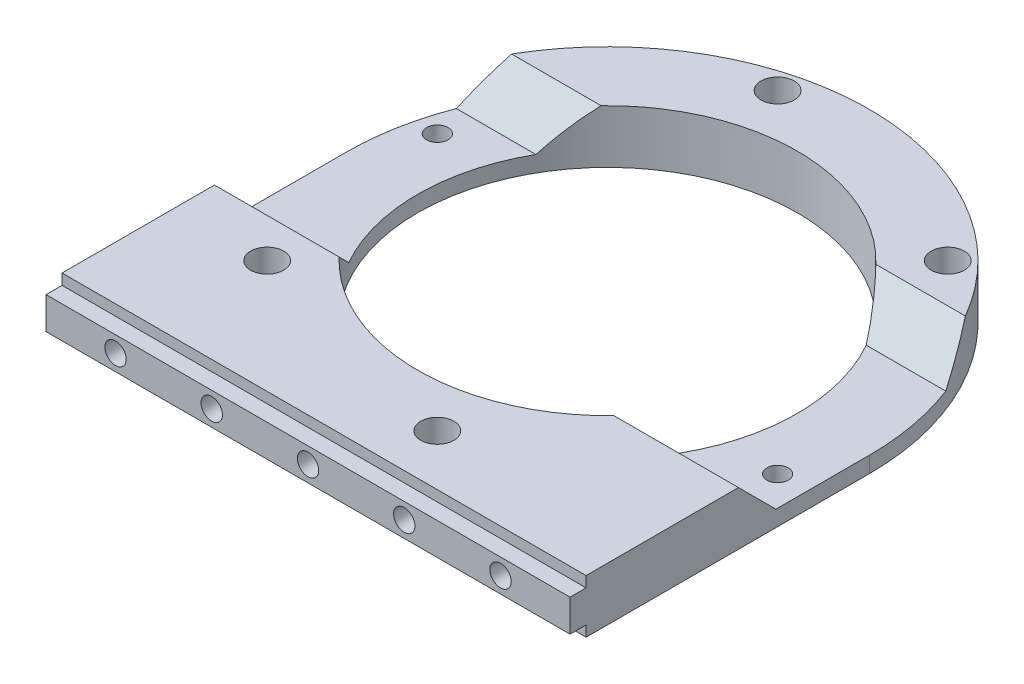
ISO-10303-21;
HEADER;
FILE_DESCRIPTION(('STEP AP214'),'2;1');
FILE_NAME('part.step','',(''),(''),'','','');
FILE_SCHEMA(('AUTOMOTIVE_DESIGN { 1 0 10303 214 1 1 1 1 }'));
ENDSEC;
DATA;
#1=APPLICATION_CONTEXT('core data for automotive mechanical design processes');
#2=APPLICATION_PROTOCOL_DEFINITION('international standard','automotive_design',2000,#1);
#3=PRODUCT_CONTEXT('',#1,'mechanical');
#4=PRODUCT('Part','Part','',(#3));
#5=PRODUCT_RELATED_PRODUCT_CATEGORY('part','',(#4));
#6=PRODUCT_DEFINITION_FORMATION('','',#4);
#7=PRODUCT_DEFINITION_CONTEXT('part definition',#1,'design');
#8=PRODUCT_DEFINITION('design','',#6,#7);
#9=PRODUCT_DEFINITION_SHAPE('','',#8);
#10=(LENGTH_UNIT() NAMED_UNIT(*) SI_UNIT(.MILLI.,.METRE.));
#11=(NAMED_UNIT(*) PLANE_ANGLE_UNIT() SI_UNIT($,.RADIAN.));
#12=(NAMED_UNIT(*) SI_UNIT($,.STERADIAN.) SOLID_ANGLE_UNIT());
#13=UNCERTAINTY_MEASURE_WITH_UNIT(LENGTH_MEASURE(1.E-05),#10,'distance_accuracy_value','');
#14=(GEOMETRIC_REPRESENTATION_CONTEXT(3) GLOBAL_UNCERTAINTY_ASSIGNED_CONTEXT((#13)) GLOBAL_UNIT_ASSIGNED_CONTEXT((#10,
#11,#12)) REPRESENTATION_CONTEXT('',''));
#15=CARTESIAN_POINT('',(0.,0.,0.));
#16=DIRECTION('',(0.,0.,1.));
#17=DIRECTION('',(1.,0.,0.));
#18=AXIS2_PLACEMENT_3D('',#15,#16,#17);
#19=CARTESIAN_POINT('',(11.6468570296169,10.,43.4666621830049));
#20=DIRECTION('',(0.,-1.,0.));
#21=DIRECTION('',(0.,0.,-1.));
#22=AXIS2_PLACEMENT_3D('',#19,#20,#21);
#23=CYLINDRICAL_SURFACE('',#22,2.00000000000043);
#24=CARTESIAN_POINT('',(11.6468570296169,0.,43.4666621830049));
#25=DIRECTION('',(0.,1.,0.));
#26=DIRECTION('',(0.,0.,1.));
#27=AXIS2_PLACEMENT_3D('',#24,#25,#26);
#28=CIRCLE('',#27,2.00000000000043);
#29=CARTESIAN_POINT('',(11.6468570296169,0.,45.4666621830053));
#30=VERTEX_POINT('',#29);
#31=EDGE_CURVE('E250',#30,#30,#28,.T.);
#32=ORIENTED_EDGE('',*,*,#31,.F.);
#33=EDGE_LOOP('',(#32));
#34=FACE_BOUND('',#33,.T.);
#35=CARTESIAN_POINT('',(11.6468570296169,5.,43.4666621830049));
#36=DIRECTION('',(0.,1.,0.));
#37=DIRECTION('',(0.,0.,1.));
#38=AXIS2_PLACEMENT_3D('',#35,#36,#37);
#39=CIRCLE('',#38,2.00000000000043);
#40=CARTESIAN_POINT('',(11.6468570296169,5.,45.4666621830053));
#41=VERTEX_POINT('',#40);
#42=EDGE_CURVE('E48',#41,#41,#39,.T.);
#43=ORIENTED_EDGE('',*,*,#42,.T.);
#44=EDGE_LOOP('',(#43));
#45=FACE_BOUND('',#44,.T.);
#46=ADVANCED_FACE('F43',(#34,#45),#23,.F.);
#47=CARTESIAN_POINT('',(31.8198051533933,10.,-31.8198051533991));
#48=DIRECTION('',(0.,-1.,0.));
#49=DIRECTION('',(0.,0.,-1.));
#50=AXIS2_PLACEMENT_3D('',#47,#48,#49);
#51=CYLINDRICAL_SURFACE('',#50,2.00000000000403);
#52=CARTESIAN_POINT('',(31.8198051533933,0.,-31.8198051533991));
#53=DIRECTION('',(0.,1.,0.));
#54=DIRECTION('',(0.,0.,1.));
#55=AXIS2_PLACEMENT_3D('',#52,#53,#54);
#56=CIRCLE('',#55,2.00000000000403);
#57=CARTESIAN_POINT('',(31.8198051533933,0.,-29.8198051533951));
#58=VERTEX_POINT('',#57);
#59=EDGE_CURVE('E244',#58,#58,#56,.T.);
#60=ORIENTED_EDGE('',*,*,#59,.F.);
#61=EDGE_LOOP('',(#60));
#62=FACE_BOUND('',#61,.T.);
#63=CARTESIAN_POINT('',(31.8198051533933,5.,-31.8198051533991));
#64=DIRECTION('',(0.,1.,0.));
#65=DIRECTION('',(0.,0.,1.));
#66=AXIS2_PLACEMENT_3D('',#63,#64,#65);
#67=CIRCLE('',#66,2.00000000000403);
#68=CARTESIAN_POINT('',(31.8198051533933,5.,-29.8198051533951));
#69=VERTEX_POINT('',#68);
#70=EDGE_CURVE('E304',#69,#69,#67,.T.);
#71=ORIENTED_EDGE('',*,*,#70,.T.);
#72=EDGE_LOOP('',(#71));
#73=FACE_BOUND('',#72,.T.);
#74=ADVANCED_FACE('F459',(#62,#73),#51,.F.);
#75=CARTESIAN_POINT('',(-11.6468570296155,10.,-43.4666621830098));
#76=DIRECTION('',(0.,-1.,0.));
#77=DIRECTION('',(0.,0.,-1.));
#78=AXIS2_PLACEMENT_3D('',#75,#76,#77);
#79=CYLINDRICAL_SURFACE('',#78,2.00000000000261);
#80=CARTESIAN_POINT('',(-11.6468570296155,0.,-43.4666621830098));
#81=DIRECTION('',(0.,1.,0.));
#82=DIRECTION('',(0.,0.,1.));
#83=AXIS2_PLACEMENT_3D('',#80,#81,#82);
#84=CIRCLE('',#83,2.00000000000261);
#85=CARTESIAN_POINT('',(-11.6468570296155,0.,-41.4666621830072));
#86=VERTEX_POINT('',#85);
#87=EDGE_CURVE('E241',#86,#86,#84,.T.);
#88=ORIENTED_EDGE('',*,*,#87,.F.);
#89=EDGE_LOOP('',(#88));
#90=FACE_BOUND('',#89,.T.);
#91=CARTESIAN_POINT('',(-11.6468570296155,5.,-43.4666621830098));
#92=DIRECTION('',(0.,1.,0.));
#93=DIRECTION('',(0.,0.,1.));
#94=AXIS2_PLACEMENT_3D('',#91,#92,#93);
#95=CIRCLE('',#94,2.00000000000261);
#96=CARTESIAN_POINT('',(-11.6468570296155,5.,-41.4666621830072));
#97=VERTEX_POINT('',#96);
#98=EDGE_CURVE('E301',#97,#97,#95,.T.);
#99=ORIENTED_EDGE('',*,*,#98,.T.);
#100=EDGE_LOOP('',(#99));
#101=FACE_BOUND('',#100,.T.);
#102=ADVANCED_FACE('F465',(#90,#101),#79,.F.);
#103=CARTESIAN_POINT('',(-31.8198051533919,10.,31.8198051533942));
#104=DIRECTION('',(0.,-1.,0.));
#105=DIRECTION('',(0.,0.,-1.));
#106=AXIS2_PLACEMENT_3D('',#103,#104,#105);
#107=CYLINDRICAL_SURFACE('',#106,1.99999999999913);
#108=CARTESIAN_POINT('',(-31.8198051533919,0.,31.8198051533942));
#109=DIRECTION('',(0.,1.,0.));
#110=DIRECTION('',(0.,0.,1.));
#111=AXIS2_PLACEMENT_3D('',#108,#109,#110);
#112=CIRCLE('',#111,1.99999999999913);
#113=CARTESIAN_POINT('',(-31.8198051533919,0.,33.8198051533934));
#114=VERTEX_POINT('',#113);
#115=EDGE_CURVE('E221',#114,#114,#112,.T.);
#116=ORIENTED_EDGE('',*,*,#115,.F.);
#117=EDGE_LOOP('',(#116));
#118=FACE_BOUND('',#117,.T.);
#119=CARTESIAN_POINT('',(-31.8198051533919,5.,31.8198051533942));
#120=DIRECTION('',(0.,1.,0.));
#121=DIRECTION('',(0.,0.,1.));
#122=AXIS2_PLACEMENT_3D('',#119,#120,#121);
#123=CIRCLE('',#122,1.99999999999913);
#124=CARTESIAN_POINT('',(-31.8198051533919,5.,33.8198051533934));
#125=VERTEX_POINT('',#124);
#126=EDGE_CURVE('E298',#125,#125,#123,.T.);
#127=ORIENTED_EDGE('',*,*,#126,.T.);
#128=EDGE_LOOP('',(#127));
#129=FACE_BOUND('',#128,.T.);
#130=ADVANCED_FACE('F478',(#118,#129),#107,.F.);
#131=CARTESIAN_POINT('',(0.,10.,0.));
#132=DIRECTION('',(0.,1.,0.));
#133=DIRECTION('',(0.,0.,1.));
#134=AXIS2_PLACEMENT_3D('',#131,#132,#133);
#135=PLANE('',#134);
#136=CARTESIAN_POINT('',(11.6468570296155,10.,43.4666621830099));
#137=DIRECTION('',(0.,1.,0.));
#138=DIRECTION('',(0.,0.,1.));
#139=AXIS2_PLACEMENT_3D('',#136,#137,#138);
#140=CIRCLE('',#139,3.10000000000027);
#141=CARTESIAN_POINT('',(11.6468570296155,10.,46.5666621830102));
#142=VERTEX_POINT('',#141);
#143=EDGE_CURVE('E329',#142,#142,#140,.T.);
#144=ORIENTED_EDGE('',*,*,#143,.F.);
#145=EDGE_LOOP('',(#144));
#146=FACE_BOUND('',#145,.T.);
#147=CARTESIAN_POINT('',(-31.8198051533951,10.,31.8198051533974));
#148=DIRECTION('',(0.,1.,0.));
#149=DIRECTION('',(0.,0.,1.));
#150=AXIS2_PLACEMENT_3D('',#147,#148,#149);
#151=CIRCLE('',#150,3.10000000000043);
#152=CARTESIAN_POINT('',(-31.8198051533951,10.,34.9198051533978));
#153=VERTEX_POINT('',#152);
#154=EDGE_CURVE('E322',#153,#153,#151,.T.);
#155=ORIENTED_EDGE('',*,*,#154,.F.);
#156=EDGE_LOOP('',(#155));
#157=FACE_BOUND('',#156,.T.);
#158=DIRECTION('',(0.,0.,-1.));
#159=VECTOR('',#158,1.);
#160=CARTESIAN_POINT('',(49.,10.,0.));
#161=LINE('',#160,#159);
#162=CARTESIAN_POINT('',(49.,10.,53.));
#163=VERTEX_POINT('',#162);
#164=CARTESIAN_POINT('',(49.,10.,24.5));
#165=VERTEX_POINT('',#164);
#166=EDGE_CURVE('E222',#163,#165,#161,.T.);
#167=ORIENTED_EDGE('',*,*,#166,.T.);
#168=DIRECTION('',(-1.,0.,0.));
#169=VECTOR('',#168,1.);
#170=CARTESIAN_POINT('',(30.886890422961,10.,24.5));
#171=LINE('',#170,#169);
#172=CARTESIAN_POINT('',(25.6904651573302,10.,24.5));
#173=VERTEX_POINT('',#172);
#174=EDGE_CURVE('E284',#165,#173,#171,.T.);
#175=ORIENTED_EDGE('',*,*,#174,.T.);
#176=CARTESIAN_POINT('',(0.,10.,0.));
#177=DIRECTION('',(0.,1.,0.));
#178=DIRECTION('',(0.,0.,1.));
#179=AXIS2_PLACEMENT_3D('',#176,#177,#178);
#180=CIRCLE('',#179,35.5);
#181=CARTESIAN_POINT('',(-25.6904651573302,10.,24.5));
#182=VERTEX_POINT('',#181);
#183=EDGE_CURVE('E231',#182,#173,#180,.T.);
#184=ORIENTED_EDGE('',*,*,#183,.F.);
#185=DIRECTION('',(-1.,0.,0.));
#186=VECTOR('',#185,1.);
#187=CARTESIAN_POINT('',(-49.,10.,24.5));
#188=LINE('',#187,#186);
#189=CARTESIAN_POINT('',(-49.,10.,24.5));
#190=VERTEX_POINT('',#189);
#191=EDGE_CURVE('E282',#182,#190,#188,.T.);
#192=ORIENTED_EDGE('',*,*,#191,.T.);
#193=DIRECTION('',(0.,0.,1.));
#194=VECTOR('',#193,1.);
#195=CARTESIAN_POINT('',(-49.,10.,0.));
#196=LINE('',#195,#194);
#197=CARTESIAN_POINT('',(-49.,10.,53.));
#198=VERTEX_POINT('',#197);
#199=EDGE_CURVE('E165',#190,#198,#196,.T.);
#200=ORIENTED_EDGE('',*,*,#199,.T.);
#201=DIRECTION('',(1.,0.,0.));
#202=VECTOR('',#201,1.);
#203=CARTESIAN_POINT('',(0.,10.,53.));
#204=LINE('',#203,#202);
#205=EDGE_CURVE('E229',#198,#163,#204,.T.);
#206=ORIENTED_EDGE('',*,*,#205,.T.);
#207=EDGE_LOOP('',(#167,#175,#184,#192,#200,#206));
#208=FACE_BOUND('',#207,.T.);
#209=ADVANCED_FACE('F425',(#146,#157,#208),#135,.T.);
#210=CARTESIAN_POINT('',(0.,10.,53.));
#211=DIRECTION('',(0.,0.,-1.));
#212=DIRECTION('',(-1.,0.,0.));
#213=AXIS2_PLACEMENT_3D('',#210,#211,#212);
#214=PLANE('',#213);
#215=DIRECTION('',(1.,0.,0.));
#216=VECTOR('',#215,1.);
#217=CARTESIAN_POINT('',(-49.,2.,53.));
#218=LINE('',#217,#216);
#219=CARTESIAN_POINT('',(-49.,2.,53.));
#220=VERTEX_POINT('',#219);
#221=CARTESIAN_POINT('',(49.,2.,53.));
#222=VERTEX_POINT('',#221);
#223=EDGE_CURVE('E198',#220,#222,#218,.T.);
#224=ORIENTED_EDGE('',*,*,#223,.F.);
#225=DIRECTION('',(0.,-1.,0.));
#226=VECTOR('',#225,1.);
#227=CARTESIAN_POINT('',(-49.,10.,53.));
#228=LINE('',#227,#226);
#229=CARTESIAN_POINT('',(-49.,0.,53.));
#230=VERTEX_POINT('',#229);
#231=EDGE_CURVE('E270',#220,#230,#228,.T.);
#232=ORIENTED_EDGE('',*,*,#231,.T.);
#233=DIRECTION('',(1.,0.,0.));
#234=VECTOR('',#233,1.);
#235=CARTESIAN_POINT('',(0.,0.,53.));
#236=LINE('',#235,#234);
#237=CARTESIAN_POINT('',(49.,0.,53.));
#238=VERTEX_POINT('',#237);
#239=EDGE_CURVE('E262',#230,#238,#236,.T.);
#240=ORIENTED_EDGE('',*,*,#239,.T.);
#241=DIRECTION('',(0.,-1.,0.));
#242=VECTOR('',#241,1.);
#243=CARTESIAN_POINT('',(49.,10.,53.));
#244=LINE('',#243,#242);
#245=EDGE_CURVE('E235',#222,#238,#244,.T.);
#246=ORIENTED_EDGE('',*,*,#245,.F.);
#247=EDGE_LOOP('',(#224,#232,#240,#246));
#248=FACE_BOUND('',#247,.T.);
#249=ADVANCED_FACE('F414',(#248),#214,.F.);
#250=DIRECTION('',(-1.,0.,0.));
#251=VECTOR('',#250,1.);
#252=CARTESIAN_POINT('',(-49.,8.,53.));
#253=LINE('',#252,#251);
#254=CARTESIAN_POINT('',(49.,8.,53.));
#255=VERTEX_POINT('',#254);
#256=CARTESIAN_POINT('',(-49.,8.,53.));
#257=VERTEX_POINT('',#256);
#258=EDGE_CURVE('E205',#255,#257,#253,.T.);
#259=ORIENTED_EDGE('',*,*,#258,.F.);
#260=EDGE_CURVE('E267',#163,#255,#244,.T.);
#261=ORIENTED_EDGE('',*,*,#260,.F.);
#262=ORIENTED_EDGE('',*,*,#205,.F.);
#263=EDGE_CURVE('E271',#198,#257,#228,.T.);
#264=ORIENTED_EDGE('',*,*,#263,.T.);
#265=EDGE_LOOP('',(#259,#261,#262,#264));
#266=FACE_BOUND('',#265,.T.);
#267=ADVANCED_FACE('F448',(#266),#214,.F.);
#268=CARTESIAN_POINT('',(49.,10.,0.));
#269=DIRECTION('',(-1.,0.,0.));
#270=DIRECTION('',(0.,0.,1.));
#271=AXIS2_PLACEMENT_3D('',#268,#269,#270);
#272=PLANE('',#271);
#273=DIRECTION('',(0.,0.,-1.));
#274=VECTOR('',#273,1.);
#275=CARTESIAN_POINT('',(49.,3.,17.5));
#276=LINE('',#275,#274);
#277=CARTESIAN_POINT('',(49.,3.,17.5));
#278=VERTEX_POINT('',#277);
#279=CARTESIAN_POINT('',(49.,3.,0.));
#280=VERTEX_POINT('',#279);
#281=EDGE_CURVE('E309',#278,#280,#276,.T.);
#282=ORIENTED_EDGE('',*,*,#281,.F.);
#283=DIRECTION('',(0.,0.707106781186546,0.707106781186549));
#284=VECTOR('',#283,1.);
#285=CARTESIAN_POINT('',(49.,3.00000000000001,17.5));
#286=LINE('',#285,#284);
#287=EDGE_CURVE('E280',#278,#165,#286,.T.);
#288=ORIENTED_EDGE('',*,*,#287,.T.);
#289=ORIENTED_EDGE('',*,*,#166,.F.);
#290=ORIENTED_EDGE('',*,*,#260,.T.);
#291=DIRECTION('',(0.,0.,-1.));
#292=VECTOR('',#291,1.);
#293=CARTESIAN_POINT('',(49.,8.,56.));
#294=LINE('',#293,#292);
#295=CARTESIAN_POINT('',(49.,8.,56.));
#296=VERTEX_POINT('',#295);
#297=EDGE_CURVE('E218',#296,#255,#294,.T.);
#298=ORIENTED_EDGE('',*,*,#297,.F.);
#299=DIRECTION('',(0.,1.,0.));
#300=VECTOR('',#299,1.);
#301=CARTESIAN_POINT('',(49.,2.,56.));
#302=LINE('',#301,#300);
#303=CARTESIAN_POINT('',(49.,2.,56.));
#304=VERTEX_POINT('',#303);
#305=EDGE_CURVE('E194',#304,#296,#302,.T.);
#306=ORIENTED_EDGE('',*,*,#305,.F.);
#307=DIRECTION('',(0.,0.,-1.));
#308=VECTOR('',#307,1.);
#309=CARTESIAN_POINT('',(49.,2.,56.));
#310=LINE('',#309,#308);
#311=EDGE_CURVE('E204',#304,#222,#310,.T.);
#312=ORIENTED_EDGE('',*,*,#311,.T.);
#313=ORIENTED_EDGE('',*,*,#245,.T.);
#314=DIRECTION('',(0.,0.,-1.));
#315=VECTOR('',#314,1.);
#316=CARTESIAN_POINT('',(49.,0.,0.));
#317=LINE('',#316,#315);
#318=CARTESIAN_POINT('',(49.,0.,0.));
#319=VERTEX_POINT('',#318);
#320=EDGE_CURVE('E253',#238,#319,#317,.T.);
#321=ORIENTED_EDGE('',*,*,#320,.T.);
#322=DIRECTION('',(0.,-1.,0.));
#323=VECTOR('',#322,1.);
#324=CARTESIAN_POINT('',(49.,10.,0.));
#325=LINE('',#324,#323);
#326=EDGE_CURVE('E275',#280,#319,#325,.T.);
#327=ORIENTED_EDGE('',*,*,#326,.F.);
#328=EDGE_LOOP('',(#282,#288,#289,#290,#298,#306,#312,#313,#321,#327));
#329=FACE_BOUND('',#328,.T.);
#330=ADVANCED_FACE('F401',(#329),#272,.F.);
#331=CARTESIAN_POINT('',(0.,10.,0.));
#332=DIRECTION('',(0.,-1.,0.));
#333=DIRECTION('',(0.,0.,-1.));
#334=AXIS2_PLACEMENT_3D('',#331,#332,#333);
#335=CYLINDRICAL_SURFACE('',#334,49.);
#336=CARTESIAN_POINT('',(0.,10.,0.));
#337=DIRECTION('',(0.,1.,0.));
#338=DIRECTION('',(0.,0.,1.));
#339=AXIS2_PLACEMENT_3D('',#336,#337,#338);
#340=CIRCLE('',#339,49.);
#341=CARTESIAN_POINT('',(42.4352447854375,10.,-24.5));
#342=VERTEX_POINT('',#341);
#343=CARTESIAN_POINT('',(-42.4352447854375,10.,-24.5));
#344=VERTEX_POINT('',#343);
#345=EDGE_CURVE('E225',#342,#344,#340,.T.);
#346=ORIENTED_EDGE('',*,*,#345,.F.);
#347=CARTESIAN_POINT('',(0.,-14.4999999999999,0.));
#348=DIRECTION('',(0.,0.707106781186549,0.707106781186546));
#349=DIRECTION('',(0.,-0.707106781186546,0.707106781186549));
#350=AXIS2_PLACEMENT_3D('',#347,#348,#349);
#351=ELLIPSE('',#350,69.2964645562815,49.);
#352=CARTESIAN_POINT('',(45.7684389071771,3.,-17.5));
#353=VERTEX_POINT('',#352);
#354=EDGE_CURVE('E53',#342,#353,#351,.F.);
#355=ORIENTED_EDGE('',*,*,#354,.T.);
#356=CARTESIAN_POINT('',(0.,3.,0.));
#357=DIRECTION('',(0.,-1.,0.));
#358=DIRECTION('',(0.,0.,-1.));
#359=AXIS2_PLACEMENT_3D('',#356,#357,#358);
#360=CIRCLE('',#359,49.);
#361=EDGE_CURVE('E193',#353,#280,#360,.T.);
#362=ORIENTED_EDGE('',*,*,#361,.T.);
#363=ORIENTED_EDGE('',*,*,#326,.T.);
#364=CARTESIAN_POINT('',(0.,0.,0.));
#365=DIRECTION('',(0.,1.,0.));
#366=DIRECTION('',(0.,0.,1.));
#367=AXIS2_PLACEMENT_3D('',#364,#365,#366);
#368=CIRCLE('',#367,49.);
#369=CARTESIAN_POINT('',(-49.,0.,0.));
#370=VERTEX_POINT('',#369);
#371=EDGE_CURVE('E256',#319,#370,#368,.T.);
#372=ORIENTED_EDGE('',*,*,#371,.T.);
#373=DIRECTION('',(0.,-1.,0.));
#374=VECTOR('',#373,1.);
#375=CARTESIAN_POINT('',(-49.,10.,0.));
#376=LINE('',#375,#374);
#377=CARTESIAN_POINT('',(-49.,3.,0.));
#378=VERTEX_POINT('',#377);
#379=EDGE_CURVE('E273',#378,#370,#376,.T.);
#380=ORIENTED_EDGE('',*,*,#379,.F.);
#381=CARTESIAN_POINT('',(-45.7684389071771,3.,-17.5));
#382=VERTEX_POINT('',#381);
#383=EDGE_CURVE('E176',#378,#382,#360,.T.);
#384=ORIENTED_EDGE('',*,*,#383,.T.);
#385=CARTESIAN_POINT('',(0.,-14.4999999999999,0.));
#386=DIRECTION('',(0.,0.707106781186549,0.707106781186546));
#387=DIRECTION('',(0.,-0.707106781186546,0.707106781186549));
#388=AXIS2_PLACEMENT_3D('',#385,#386,#387);
#389=ELLIPSE('',#388,69.2964645562815,49.);
#390=EDGE_CURVE('E61',#382,#344,#389,.F.);
#391=ORIENTED_EDGE('',*,*,#390,.T.);
#392=EDGE_LOOP('',(#346,#355,#362,#363,#372,#380,#384,#391));
#393=FACE_BOUND('',#392,.T.);
#394=ADVANCED_FACE('F420',(#393),#335,.T.);
#395=CARTESIAN_POINT('',(-49.,10.,0.));
#396=DIRECTION('',(1.,0.,0.));
#397=DIRECTION('',(0.,0.,-1.));
#398=AXIS2_PLACEMENT_3D('',#395,#396,#397);
#399=PLANE('',#398);
#400=ORIENTED_EDGE('',*,*,#199,.F.);
#401=DIRECTION('',(0.,-0.707106781186546,-0.707106781186549));
#402=VECTOR('',#401,1.);
#403=CARTESIAN_POINT('',(-49.,3.00000000000001,17.5));
#404=LINE('',#403,#402);
#405=CARTESIAN_POINT('',(-49.,3.,17.5));
#406=VERTEX_POINT('',#405);
#407=EDGE_CURVE('E11',#190,#406,#404,.T.);
#408=ORIENTED_EDGE('',*,*,#407,.T.);
#409=DIRECTION('',(0.,0.,1.));
#410=VECTOR('',#409,1.);
#411=CARTESIAN_POINT('',(-49.,3.,17.5));
#412=LINE('',#411,#410);
#413=EDGE_CURVE('E162',#378,#406,#412,.T.);
#414=ORIENTED_EDGE('',*,*,#413,.F.);
#415=ORIENTED_EDGE('',*,*,#379,.T.);
#416=DIRECTION('',(0.,0.,1.));
#417=VECTOR('',#416,1.);
#418=CARTESIAN_POINT('',(-49.,0.,0.));
#419=LINE('',#418,#417);
#420=EDGE_CURVE('E259',#370,#230,#419,.T.);
#421=ORIENTED_EDGE('',*,*,#420,.T.);
#422=ORIENTED_EDGE('',*,*,#231,.F.);
#423=DIRECTION('',(0.,0.,-1.));
#424=VECTOR('',#423,1.);
#425=CARTESIAN_POINT('',(-49.,2.,56.));
#426=LINE('',#425,#424);
#427=CARTESIAN_POINT('',(-49.,2.,56.));
#428=VERTEX_POINT('',#427);
#429=EDGE_CURVE('E212',#428,#220,#426,.T.);
#430=ORIENTED_EDGE('',*,*,#429,.F.);
#431=DIRECTION('',(0.,-1.,0.));
#432=VECTOR('',#431,1.);
#433=CARTESIAN_POINT('',(-49.,2.,56.));
#434=LINE('',#433,#432);
#435=CARTESIAN_POINT('',(-49.,8.,56.));
#436=VERTEX_POINT('',#435);
#437=EDGE_CURVE('E200',#436,#428,#434,.T.);
#438=ORIENTED_EDGE('',*,*,#437,.F.);
#439=DIRECTION('',(0.,0.,-1.));
#440=VECTOR('',#439,1.);
#441=CARTESIAN_POINT('',(-49.,8.,56.));
#442=LINE('',#441,#440);
#443=EDGE_CURVE('E215',#436,#257,#442,.T.);
#444=ORIENTED_EDGE('',*,*,#443,.T.);
#445=ORIENTED_EDGE('',*,*,#263,.F.);
#446=EDGE_LOOP('',(#400,#408,#414,#415,#421,#422,#430,#438,#444,#445));
#447=FACE_BOUND('',#446,.T.);
#448=ADVANCED_FACE('F161',(#447),#399,.F.);
#449=CARTESIAN_POINT('',(43.4666621830095,10.,11.6468570296082));
#450=DIRECTION('',(0.,-1.,0.));
#451=DIRECTION('',(0.,0.,-1.));
#452=AXIS2_PLACEMENT_3D('',#449,#450,#451);
#453=CYLINDRICAL_SURFACE('',#452,2.00000000000291);
#454=CARTESIAN_POINT('',(43.4666621830095,3.,11.6468570296082));
#455=DIRECTION('',(0.,-1.,0.));
#456=DIRECTION('',(0.,0.,-1.));
#457=AXIS2_PLACEMENT_3D('',#454,#455,#456);
#458=CIRCLE('',#457,2.00000000000291);
#459=CARTESIAN_POINT('',(43.4666621830095,3.,9.64685702960534));
#460=VERTEX_POINT('',#459);
#461=EDGE_CURVE('E185',#460,#460,#458,.T.);
#462=ORIENTED_EDGE('',*,*,#461,.F.);
#463=EDGE_LOOP('',(#462));
#464=FACE_BOUND('',#463,.T.);
#465=CARTESIAN_POINT('',(43.4666621830095,0.,11.6468570296082));
#466=DIRECTION('',(0.,1.,0.));
#467=DIRECTION('',(0.,0.,1.));
#468=AXIS2_PLACEMENT_3D('',#465,#466,#467);
#469=CIRCLE('',#468,2.00000000000291);
#470=CARTESIAN_POINT('',(43.4666621830095,0.,13.6468570296111));
#471=VERTEX_POINT('',#470);
#472=EDGE_CURVE('E247',#471,#471,#469,.T.);
#473=ORIENTED_EDGE('',*,*,#472,.F.);
#474=EDGE_LOOP('',(#473));
#475=FACE_BOUND('',#474,.T.);
#476=ADVANCED_FACE('F471',(#464,#475),#453,.F.);
#477=CARTESIAN_POINT('',(-43.4666621830081,10.,-11.6468570296131));
#478=DIRECTION('',(0.,-1.,0.));
#479=DIRECTION('',(0.,0.,-1.));
#480=AXIS2_PLACEMENT_3D('',#477,#478,#479);
#481=CYLINDRICAL_SURFACE('',#480,2.);
#482=CARTESIAN_POINT('',(-43.4666621830081,3.,-11.6468570296131));
#483=DIRECTION('',(0.,-1.,0.));
#484=DIRECTION('',(0.,0.,-1.));
#485=AXIS2_PLACEMENT_3D('',#482,#483,#484);
#486=CIRCLE('',#485,2.);
#487=CARTESIAN_POINT('',(-43.4666621830081,3.,-13.6468570296131));
#488=VERTEX_POINT('',#487);
#489=EDGE_CURVE('E182',#488,#488,#486,.T.);
#490=ORIENTED_EDGE('',*,*,#489,.F.);
#491=EDGE_LOOP('',(#490));
#492=FACE_BOUND('',#491,.T.);
#493=CARTESIAN_POINT('',(-43.4666621830081,0.,-11.6468570296131));
#494=DIRECTION('',(0.,1.,0.));
#495=DIRECTION('',(0.,0.,1.));
#496=AXIS2_PLACEMENT_3D('',#493,#494,#495);
#497=CIRCLE('',#496,2.);
#498=CARTESIAN_POINT('',(-43.4666621830081,0.,-9.64685702961314));
#499=VERTEX_POINT('',#498);
#500=EDGE_CURVE('E238',#499,#499,#497,.T.);
#501=ORIENTED_EDGE('',*,*,#500,.F.);
#502=EDGE_LOOP('',(#501));
#503=FACE_BOUND('',#502,.T.);
#504=ADVANCED_FACE('F473',(#492,#503),#481,.F.);
#505=CARTESIAN_POINT('',(0.,10.,0.));
#506=DIRECTION('',(0.,-1.,0.));
#507=DIRECTION('',(0.,0.,-1.));
#508=AXIS2_PLACEMENT_3D('',#505,#506,#507);
#509=CYLINDRICAL_SURFACE('',#508,35.5);
#510=ORIENTED_EDGE('',*,*,#183,.T.);
#511=CARTESIAN_POINT('',(0.,-14.4999999999999,0.));
#512=DIRECTION('',(0.,0.707106781186549,-0.707106781186546));
#513=DIRECTION('',(0.,-0.707106781186546,-0.707106781186549));
#514=AXIS2_PLACEMENT_3D('',#511,#512,#513);
#515=ELLIPSE('',#514,50.2045814642448,35.5);
#516=CARTESIAN_POINT('',(30.886890422961,3.,17.5));
#517=VERTEX_POINT('',#516);
#518=EDGE_CURVE('E291',#173,#517,#515,.T.);
#519=ORIENTED_EDGE('',*,*,#518,.T.);
#520=CARTESIAN_POINT('',(0.,3.,0.));
#521=DIRECTION('',(0.,-1.,0.));
#522=DIRECTION('',(0.,0.,-1.));
#523=AXIS2_PLACEMENT_3D('',#520,#521,#522);
#524=CIRCLE('',#523,35.5);
#525=CARTESIAN_POINT('',(30.886890422961,3.,-17.5));
#526=VERTEX_POINT('',#525);
#527=EDGE_CURVE('E279',#526,#517,#524,.T.);
#528=ORIENTED_EDGE('',*,*,#527,.F.);
#529=CARTESIAN_POINT('',(0.,-14.4999999999999,0.));
#530=DIRECTION('',(0.,0.707106781186549,0.707106781186546));
#531=DIRECTION('',(0.,-0.707106781186546,0.707106781186549));
#532=AXIS2_PLACEMENT_3D('',#529,#530,#531);
#533=ELLIPSE('',#532,50.2045814642448,35.5);
#534=CARTESIAN_POINT('',(25.6904651573302,10.,-24.5));
#535=VERTEX_POINT('',#534);
#536=EDGE_CURVE('E289',#526,#535,#533,.T.);
#537=ORIENTED_EDGE('',*,*,#536,.T.);
#538=CARTESIAN_POINT('',(-25.6904651573302,10.,-24.5));
#539=VERTEX_POINT('',#538);
#540=EDGE_CURVE('E232',#535,#539,#180,.T.);
#541=ORIENTED_EDGE('',*,*,#540,.T.);
#542=CARTESIAN_POINT('',(0.,-14.4999999999999,0.));
#543=DIRECTION('',(0.,0.707106781186549,0.707106781186546));
#544=DIRECTION('',(0.,-0.707106781186546,0.707106781186549));
#545=AXIS2_PLACEMENT_3D('',#542,#543,#544);
#546=ELLIPSE('',#545,50.2045814642448,35.5);
#547=CARTESIAN_POINT('',(-30.886890422961,3.,-17.5));
#548=VERTEX_POINT('',#547);
#549=EDGE_CURVE('E286',#539,#548,#546,.T.);
#550=ORIENTED_EDGE('',*,*,#549,.T.);
#551=CARTESIAN_POINT('',(-30.886890422961,3.,17.5));
#552=VERTEX_POINT('',#551);
#553=EDGE_CURVE('E277',#552,#548,#524,.T.);
#554=ORIENTED_EDGE('',*,*,#553,.F.);
#555=CARTESIAN_POINT('',(0.,-14.4999999999999,0.));
#556=DIRECTION('',(0.,0.707106781186549,-0.707106781186546));
#557=DIRECTION('',(0.,-0.707106781186546,-0.707106781186549));
#558=AXIS2_PLACEMENT_3D('',#555,#556,#557);
#559=ELLIPSE('',#558,50.2045814642448,35.5);
#560=EDGE_CURVE('E181',#552,#182,#559,.T.);
#561=ORIENTED_EDGE('',*,*,#560,.T.);
#562=EDGE_LOOP('',(#510,#519,#528,#537,#541,#550,#554,#561));
#563=FACE_BOUND('',#562,.T.);
#564=CARTESIAN_POINT('',(0.,0.,0.));
#565=DIRECTION('',(0.,1.,0.));
#566=DIRECTION('',(0.,0.,1.));
#567=AXIS2_PLACEMENT_3D('',#564,#565,#566);
#568=CIRCLE('',#567,35.5);
#569=CARTESIAN_POINT('',(0.,0.,35.5));
#570=VERTEX_POINT('',#569);
#571=EDGE_CURVE('E226',#570,#570,#568,.T.);
#572=ORIENTED_EDGE('',*,*,#571,.F.);
#573=EDGE_LOOP('',(#572));
#574=FACE_BOUND('',#573,.T.);
#575=ADVANCED_FACE('F434',(#563,#574),#509,.F.);
#576=CARTESIAN_POINT('',(-11.6468570296155,10.,-43.4666621830098));
#577=DIRECTION('',(0.,1.,0.));
#578=DIRECTION('',(0.,0.,1.));
#579=AXIS2_PLACEMENT_3D('',#576,#577,#578);
#580=CIRCLE('',#579,3.1);
#581=CARTESIAN_POINT('',(-11.6468570296155,10.,-40.3666621830098));
#582=VERTEX_POINT('',#581);
#583=EDGE_CURVE('E338',#582,#582,#580,.T.);
#584=ORIENTED_EDGE('',*,*,#583,.F.);
#585=EDGE_LOOP('',(#584));
#586=FACE_BOUND('',#585,.T.);
#587=CARTESIAN_POINT('',(31.8198051533951,10.,-31.8198051533973));
#588=DIRECTION('',(0.,1.,0.));
#589=DIRECTION('',(0.,0.,1.));
#590=AXIS2_PLACEMENT_3D('',#587,#588,#589);
#591=CIRCLE('',#590,3.10000000000008);
#592=CARTESIAN_POINT('',(31.8198051533951,10.,-28.7198051533972));
#593=VERTEX_POINT('',#592);
#594=EDGE_CURVE('E335',#593,#593,#591,.T.);
#595=ORIENTED_EDGE('',*,*,#594,.F.);
#596=EDGE_LOOP('',(#595));
#597=FACE_BOUND('',#596,.T.);
#598=ORIENTED_EDGE('',*,*,#540,.F.);
#599=DIRECTION('',(1.,0.,0.));
#600=VECTOR('',#599,1.);
#601=CARTESIAN_POINT('',(45.7684389071771,10.,-24.5));
#602=LINE('',#601,#600);
#603=EDGE_CURVE('E68',#535,#342,#602,.T.);
#604=ORIENTED_EDGE('',*,*,#603,.T.);
#605=ORIENTED_EDGE('',*,*,#345,.T.);
#606=DIRECTION('',(1.,0.,0.));
#607=VECTOR('',#606,1.);
#608=CARTESIAN_POINT('',(-30.886890422961,10.,-24.5));
#609=LINE('',#608,#607);
#610=EDGE_CURVE('E293',#344,#539,#609,.T.);
#611=ORIENTED_EDGE('',*,*,#610,.T.);
#612=EDGE_LOOP('',(#598,#604,#605,#611));
#613=FACE_BOUND('',#612,.T.);
#614=ADVANCED_FACE('F443',(#586,#597,#613),#135,.T.);
#615=CARTESIAN_POINT('',(0.,0.,0.));
#616=DIRECTION('',(0.,1.,0.));
#617=DIRECTION('',(0.,0.,1.));
#618=AXIS2_PLACEMENT_3D('',#615,#616,#617);
#619=PLANE('',#618);
#620=ORIENTED_EDGE('',*,*,#115,.T.);
#621=EDGE_LOOP('',(#620));
#622=FACE_BOUND('',#621,.T.);
#623=ORIENTED_EDGE('',*,*,#500,.T.);
#624=EDGE_LOOP('',(#623));
#625=FACE_BOUND('',#624,.T.);
#626=ORIENTED_EDGE('',*,*,#87,.T.);
#627=EDGE_LOOP('',(#626));
#628=FACE_BOUND('',#627,.T.);
#629=ORIENTED_EDGE('',*,*,#59,.T.);
#630=EDGE_LOOP('',(#629));
#631=FACE_BOUND('',#630,.T.);
#632=ORIENTED_EDGE('',*,*,#472,.T.);
#633=EDGE_LOOP('',(#632));
#634=FACE_BOUND('',#633,.T.);
#635=ORIENTED_EDGE('',*,*,#31,.T.);
#636=EDGE_LOOP('',(#635));
#637=FACE_BOUND('',#636,.T.);
#638=ORIENTED_EDGE('',*,*,#320,.F.);
#639=ORIENTED_EDGE('',*,*,#239,.F.);
#640=ORIENTED_EDGE('',*,*,#420,.F.);
#641=ORIENTED_EDGE('',*,*,#371,.F.);
#642=EDGE_LOOP('',(#638,#639,#640,#641));
#643=FACE_BOUND('',#642,.T.);
#644=ORIENTED_EDGE('',*,*,#571,.T.);
#645=EDGE_LOOP('',(#644));
#646=FACE_BOUND('',#645,.T.);
#647=ADVANCED_FACE('F418',(#622,#625,#628,#631,#634,#637,#643,#646),#619,.F.);
#648=CARTESIAN_POINT('',(-49.,8.,56.));
#649=DIRECTION('',(0.,-1.,0.));
#650=DIRECTION('',(0.,0.,-1.));
#651=AXIS2_PLACEMENT_3D('',#648,#649,#650);
#652=PLANE('',#651);
#653=ORIENTED_EDGE('',*,*,#258,.T.);
#654=ORIENTED_EDGE('',*,*,#443,.F.);
#655=DIRECTION('',(-1.,0.,0.));
#656=VECTOR('',#655,1.);
#657=CARTESIAN_POINT('',(-49.,8.,56.));
#658=LINE('',#657,#656);
#659=EDGE_CURVE('E197',#296,#436,#658,.T.);
#660=ORIENTED_EDGE('',*,*,#659,.F.);
#661=ORIENTED_EDGE('',*,*,#297,.T.);
#662=EDGE_LOOP('',(#653,#654,#660,#661));
#663=FACE_BOUND('',#662,.T.);
#664=ADVANCED_FACE('F405',(#663),#652,.F.);
#665=CARTESIAN_POINT('',(-49.,2.,56.));
#666=DIRECTION('',(0.,1.,0.));
#667=DIRECTION('',(0.,0.,1.));
#668=AXIS2_PLACEMENT_3D('',#665,#666,#667);
#669=PLANE('',#668);
#670=ORIENTED_EDGE('',*,*,#223,.T.);
#671=ORIENTED_EDGE('',*,*,#311,.F.);
#672=DIRECTION('',(1.,0.,0.));
#673=VECTOR('',#672,1.);
#674=CARTESIAN_POINT('',(-49.,2.,56.));
#675=LINE('',#674,#673);
#676=EDGE_CURVE('E202',#428,#304,#675,.T.);
#677=ORIENTED_EDGE('',*,*,#676,.F.);
#678=ORIENTED_EDGE('',*,*,#429,.T.);
#679=EDGE_LOOP('',(#670,#671,#677,#678));
#680=FACE_BOUND('',#679,.T.);
#681=ADVANCED_FACE('F385',(#680),#669,.F.);
#682=CARTESIAN_POINT('',(0.,0.,56.));
#683=DIRECTION('',(0.,0.,-1.));
#684=DIRECTION('',(-1.,0.,0.));
#685=AXIS2_PLACEMENT_3D('',#682,#683,#684);
#686=PLANE('',#685);
#687=CARTESIAN_POINT('',(-36.,5.00000000000001,56.));
#688=DIRECTION('',(0.,0.,1.));
#689=DIRECTION('',(1.,0.,0.));
#690=AXIS2_PLACEMENT_3D('',#687,#688,#689);
#691=CIRCLE('',#690,2.);
#692=CARTESIAN_POINT('',(-34.,5.00000000000001,56.));
#693=VERTEX_POINT('',#692);
#694=EDGE_CURVE('E367',#693,#693,#691,.T.);
#695=ORIENTED_EDGE('',*,*,#694,.F.);
#696=EDGE_LOOP('',(#695));
#697=FACE_BOUND('',#696,.T.);
#698=CARTESIAN_POINT('',(-18.,5.00000000000001,56.));
#699=DIRECTION('',(0.,0.,1.));
#700=DIRECTION('',(1.,0.,0.));
#701=AXIS2_PLACEMENT_3D('',#698,#699,#700);
#702=CIRCLE('',#701,2.);
#703=CARTESIAN_POINT('',(-16.,5.00000000000001,56.));
#704=VERTEX_POINT('',#703);
#705=EDGE_CURVE('E364',#704,#704,#702,.T.);
#706=ORIENTED_EDGE('',*,*,#705,.F.);
#707=EDGE_LOOP('',(#706));
#708=FACE_BOUND('',#707,.T.);
#709=CARTESIAN_POINT('',(0.,5.00000000000001,56.));
#710=DIRECTION('',(0.,0.,1.));
#711=DIRECTION('',(1.,0.,0.));
#712=AXIS2_PLACEMENT_3D('',#709,#710,#711);
#713=CIRCLE('',#712,2.);
#714=CARTESIAN_POINT('',(2.,5.00000000000001,56.));
#715=VERTEX_POINT('',#714);
#716=EDGE_CURVE('E358',#715,#715,#713,.T.);
#717=ORIENTED_EDGE('',*,*,#716,.F.);
#718=EDGE_LOOP('',(#717));
#719=FACE_BOUND('',#718,.T.);
#720=CARTESIAN_POINT('',(18.,5.00000000000001,56.));
#721=DIRECTION('',(0.,0.,1.));
#722=DIRECTION('',(1.,0.,0.));
#723=AXIS2_PLACEMENT_3D('',#720,#721,#722);
#724=CIRCLE('',#723,2.);
#725=CARTESIAN_POINT('',(20.,5.00000000000001,56.));
#726=VERTEX_POINT('',#725);
#727=EDGE_CURVE('E352',#726,#726,#724,.T.);
#728=ORIENTED_EDGE('',*,*,#727,.F.);
#729=EDGE_LOOP('',(#728));
#730=FACE_BOUND('',#729,.T.);
#731=CARTESIAN_POINT('',(36.,5.00000000000001,56.));
#732=DIRECTION('',(0.,0.,1.));
#733=DIRECTION('',(1.,0.,0.));
#734=AXIS2_PLACEMENT_3D('',#731,#732,#733);
#735=CIRCLE('',#734,2.);
#736=CARTESIAN_POINT('',(38.,5.00000000000001,56.));
#737=VERTEX_POINT('',#736);
#738=EDGE_CURVE('E346',#737,#737,#735,.T.);
#739=ORIENTED_EDGE('',*,*,#738,.F.);
#740=EDGE_LOOP('',(#739));
#741=FACE_BOUND('',#740,.T.);
#742=ORIENTED_EDGE('',*,*,#305,.T.);
#743=ORIENTED_EDGE('',*,*,#659,.T.);
#744=ORIENTED_EDGE('',*,*,#437,.T.);
#745=ORIENTED_EDGE('',*,*,#676,.T.);
#746=EDGE_LOOP('',(#742,#743,#744,#745));
#747=FACE_BOUND('',#746,.T.);
#748=ADVANCED_FACE('F382',(#697,#708,#719,#730,#741,#747),#686,.F.);
#749=CARTESIAN_POINT('',(0.,3.,0.));
#750=DIRECTION('',(0.,-1.,0.));
#751=DIRECTION('',(0.,0.,-1.));
#752=AXIS2_PLACEMENT_3D('',#749,#750,#751);
#753=PLANE('',#752);
#754=ORIENTED_EDGE('',*,*,#489,.T.);
#755=EDGE_LOOP('',(#754));
#756=FACE_BOUND('',#755,.T.);
#757=ORIENTED_EDGE('',*,*,#413,.T.);
#758=DIRECTION('',(1.,0.,0.));
#759=VECTOR('',#758,1.);
#760=CARTESIAN_POINT('',(-49.,3.,17.5));
#761=LINE('',#760,#759);
#762=EDGE_CURVE('E173',#406,#552,#761,.T.);
#763=ORIENTED_EDGE('',*,*,#762,.T.);
#764=ORIENTED_EDGE('',*,*,#553,.T.);
#765=DIRECTION('',(-1.,0.,0.));
#766=VECTOR('',#765,1.);
#767=CARTESIAN_POINT('',(-49.,3.,-17.5));
#768=LINE('',#767,#766);
#769=EDGE_CURVE('E312',#548,#382,#768,.T.);
#770=ORIENTED_EDGE('',*,*,#769,.T.);
#771=ORIENTED_EDGE('',*,*,#383,.F.);
#772=EDGE_LOOP('',(#757,#763,#764,#770,#771));
#773=FACE_BOUND('',#772,.T.);
#774=ADVANCED_FACE('F171',(#756,#773),#753,.F.);
#775=ORIENTED_EDGE('',*,*,#461,.T.);
#776=EDGE_LOOP('',(#775));
#777=FACE_BOUND('',#776,.T.);
#778=EDGE_CURVE('E178',#353,#526,#768,.T.);
#779=ORIENTED_EDGE('',*,*,#778,.T.);
#780=ORIENTED_EDGE('',*,*,#527,.T.);
#781=EDGE_CURVE('E177',#517,#278,#761,.T.);
#782=ORIENTED_EDGE('',*,*,#781,.T.);
#783=ORIENTED_EDGE('',*,*,#281,.T.);
#784=ORIENTED_EDGE('',*,*,#361,.F.);
#785=EDGE_LOOP('',(#779,#780,#782,#783,#784));
#786=FACE_BOUND('',#785,.T.);
#787=ADVANCED_FACE('F437',(#777,#786),#753,.F.);
#788=CARTESIAN_POINT('',(-49.,3.00000000000001,17.5));
#789=DIRECTION('',(0.,0.707106781186549,-0.707106781186546));
#790=DIRECTION('',(-1.,0.,0.));
#791=AXIS2_PLACEMENT_3D('',#788,#789,#790);
#792=PLANE('',#791);
#793=ORIENTED_EDGE('',*,*,#518,.F.);
#794=ORIENTED_EDGE('',*,*,#174,.F.);
#795=ORIENTED_EDGE('',*,*,#287,.F.);
#796=ORIENTED_EDGE('',*,*,#781,.F.);
#797=EDGE_LOOP('',(#793,#794,#795,#796));
#798=FACE_BOUND('',#797,.T.);
#799=ADVANCED_FACE('F430',(#798),#792,.T.);
#800=CARTESIAN_POINT('',(-49.,3.00000000000001,-17.5));
#801=DIRECTION('',(0.,0.707106781186549,0.707106781186546));
#802=DIRECTION('',(1.,0.,0.));
#803=AXIS2_PLACEMENT_3D('',#800,#801,#802);
#804=PLANE('',#803);
#805=ORIENTED_EDGE('',*,*,#354,.F.);
#806=ORIENTED_EDGE('',*,*,#603,.F.);
#807=ORIENTED_EDGE('',*,*,#536,.F.);
#808=ORIENTED_EDGE('',*,*,#778,.F.);
#809=EDGE_LOOP('',(#805,#806,#807,#808));
#810=FACE_BOUND('',#809,.T.);
#811=ADVANCED_FACE('F441',(#810),#804,.T.);
#812=CARTESIAN_POINT('',(-49.,3.00000000000001,17.5));
#813=DIRECTION('',(0.,0.707106781186549,-0.707106781186546));
#814=DIRECTION('',(-1.,0.,0.));
#815=AXIS2_PLACEMENT_3D('',#812,#813,#814);
#816=PLANE('',#815);
#817=ORIENTED_EDGE('',*,*,#407,.F.);
#818=ORIENTED_EDGE('',*,*,#191,.F.);
#819=ORIENTED_EDGE('',*,*,#560,.F.);
#820=ORIENTED_EDGE('',*,*,#762,.F.);
#821=EDGE_LOOP('',(#817,#818,#819,#820));
#822=FACE_BOUND('',#821,.T.);
#823=ADVANCED_FACE('F180',(#822),#816,.T.);
#824=CARTESIAN_POINT('',(-49.,3.00000000000001,-17.5));
#825=DIRECTION('',(0.,0.707106781186549,0.707106781186546));
#826=DIRECTION('',(1.,0.,0.));
#827=AXIS2_PLACEMENT_3D('',#824,#825,#826);
#828=PLANE('',#827);
#829=ORIENTED_EDGE('',*,*,#549,.F.);
#830=ORIENTED_EDGE('',*,*,#610,.F.);
#831=ORIENTED_EDGE('',*,*,#390,.F.);
#832=ORIENTED_EDGE('',*,*,#769,.F.);
#833=EDGE_LOOP('',(#829,#830,#831,#832));
#834=FACE_BOUND('',#833,.T.);
#835=ADVANCED_FACE('F46',(#834),#828,.T.);
#836=CARTESIAN_POINT('',(31.8198051533951,5.,-31.8198051533973));
#837=DIRECTION('',(0.,1.,0.));
#838=DIRECTION('',(0.,0.,1.));
#839=AXIS2_PLACEMENT_3D('',#836,#837,#838);
#840=CYLINDRICAL_SURFACE('',#839,3.10000000000008);
#841=CARTESIAN_POINT('',(31.8198051533951,5.,-31.8198051533973));
#842=DIRECTION('',(0.,1.,0.));
#843=DIRECTION('',(0.,0.,1.));
#844=AXIS2_PLACEMENT_3D('',#841,#842,#843);
#845=CIRCLE('',#844,3.10000000000008);
#846=CARTESIAN_POINT('',(31.8198051533951,5.,-28.7198051533972));
#847=VERTEX_POINT('',#846);
#848=EDGE_CURVE('E332',#847,#847,#845,.T.);
#849=ORIENTED_EDGE('',*,*,#848,.F.);
#850=EDGE_LOOP('',(#849));
#851=FACE_BOUND('',#850,.T.);
#852=ORIENTED_EDGE('',*,*,#594,.T.);
#853=EDGE_LOOP('',(#852));
#854=FACE_BOUND('',#853,.T.);
#855=ADVANCED_FACE('F502',(#851,#854),#840,.F.);
#856=CARTESIAN_POINT('',(31.8198051533951,5.,-31.8198051533973));
#857=DIRECTION('',(0.,1.,0.));
#858=DIRECTION('',(0.,0.,1.));
#859=AXIS2_PLACEMENT_3D('',#856,#857,#858);
#860=PLANE('',#859);
#861=ORIENTED_EDGE('',*,*,#70,.F.);
#862=EDGE_LOOP('',(#861));
#863=FACE_BOUND('',#862,.T.);
#864=ORIENTED_EDGE('',*,*,#848,.T.);
#865=EDGE_LOOP('',(#864));
#866=FACE_BOUND('',#865,.T.);
#867=ADVANCED_FACE('F506',(#863,#866),#860,.T.);
#868=CARTESIAN_POINT('',(-11.6468570296155,5.,-43.4666621830098));
#869=DIRECTION('',(0.,1.,0.));
#870=DIRECTION('',(0.,0.,1.));
#871=AXIS2_PLACEMENT_3D('',#868,#869,#870);
#872=CYLINDRICAL_SURFACE('',#871,3.1);
#873=CARTESIAN_POINT('',(-11.6468570296155,5.,-43.4666621830098));
#874=DIRECTION('',(0.,1.,0.));
#875=DIRECTION('',(0.,0.,1.));
#876=AXIS2_PLACEMENT_3D('',#873,#874,#875);
#877=CIRCLE('',#876,3.1);
#878=CARTESIAN_POINT('',(-11.6468570296155,5.,-40.3666621830098));
#879=VERTEX_POINT('',#878);
#880=EDGE_CURVE('E302',#879,#879,#877,.T.);
#881=ORIENTED_EDGE('',*,*,#880,.F.);
#882=EDGE_LOOP('',(#881));
#883=FACE_BOUND('',#882,.T.);
#884=ORIENTED_EDGE('',*,*,#583,.T.);
#885=EDGE_LOOP('',(#884));
#886=FACE_BOUND('',#885,.T.);
#887=ADVANCED_FACE('F512',(#883,#886),#872,.F.);
#888=CARTESIAN_POINT('',(-11.6468570296155,5.,-43.4666621830098));
#889=DIRECTION('',(0.,1.,0.));
#890=DIRECTION('',(0.,0.,1.));
#891=AXIS2_PLACEMENT_3D('',#888,#889,#890);
#892=PLANE('',#891);
#893=ORIENTED_EDGE('',*,*,#98,.F.);
#894=EDGE_LOOP('',(#893));
#895=FACE_BOUND('',#894,.T.);
#896=ORIENTED_EDGE('',*,*,#880,.T.);
#897=EDGE_LOOP('',(#896));
#898=FACE_BOUND('',#897,.T.);
#899=ADVANCED_FACE('F533',(#895,#898),#892,.T.);
#900=CARTESIAN_POINT('',(-31.8198051533951,5.,31.8198051533974));
#901=DIRECTION('',(0.,1.,0.));
#902=DIRECTION('',(0.,0.,1.));
#903=AXIS2_PLACEMENT_3D('',#900,#901,#902);
#904=CYLINDRICAL_SURFACE('',#903,3.10000000000043);
#905=CARTESIAN_POINT('',(-31.8198051533951,5.,31.8198051533974));
#906=DIRECTION('',(0.,1.,0.));
#907=DIRECTION('',(0.,0.,1.));
#908=AXIS2_PLACEMENT_3D('',#905,#906,#907);
#909=CIRCLE('',#908,3.10000000000043);
#910=CARTESIAN_POINT('',(-31.8198051533951,5.,34.9198051533978));
#911=VERTEX_POINT('',#910);
#912=EDGE_CURVE('E319',#911,#911,#909,.T.);
#913=ORIENTED_EDGE('',*,*,#912,.F.);
#914=EDGE_LOOP('',(#913));
#915=FACE_BOUND('',#914,.T.);
#916=ORIENTED_EDGE('',*,*,#154,.T.);
#917=EDGE_LOOP('',(#916));
#918=FACE_BOUND('',#917,.T.);
#919=ADVANCED_FACE('F530',(#915,#918),#904,.F.);
#920=CARTESIAN_POINT('',(-31.8198051533951,5.,31.8198051533974));
#921=DIRECTION('',(0.,1.,0.));
#922=DIRECTION('',(0.,0.,1.));
#923=AXIS2_PLACEMENT_3D('',#920,#921,#922);
#924=PLANE('',#923);
#925=ORIENTED_EDGE('',*,*,#126,.F.);
#926=EDGE_LOOP('',(#925));
#927=FACE_BOUND('',#926,.T.);
#928=ORIENTED_EDGE('',*,*,#912,.T.);
#929=EDGE_LOOP('',(#928));
#930=FACE_BOUND('',#929,.T.);
#931=ADVANCED_FACE('F524',(#927,#930),#924,.T.);
#932=CARTESIAN_POINT('',(11.6468570296155,5.,43.4666621830099));
#933=DIRECTION('',(0.,1.,0.));
#934=DIRECTION('',(0.,0.,1.));
#935=AXIS2_PLACEMENT_3D('',#932,#933,#934);
#936=CYLINDRICAL_SURFACE('',#935,3.10000000000027);
#937=CARTESIAN_POINT('',(11.6468570296155,5.,43.4666621830099));
#938=DIRECTION('',(0.,1.,0.));
#939=DIRECTION('',(0.,0.,1.));
#940=AXIS2_PLACEMENT_3D('',#937,#938,#939);
#941=CIRCLE('',#940,3.10000000000027);
#942=CARTESIAN_POINT('',(11.6468570296155,5.,46.5666621830102));
#943=VERTEX_POINT('',#942);
#944=EDGE_CURVE('E326',#943,#943,#941,.T.);
#945=ORIENTED_EDGE('',*,*,#944,.F.);
#946=EDGE_LOOP('',(#945));
#947=FACE_BOUND('',#946,.T.);
#948=ORIENTED_EDGE('',*,*,#143,.T.);
#949=EDGE_LOOP('',(#948));
#950=FACE_BOUND('',#949,.T.);
#951=ADVANCED_FACE('F520',(#947,#950),#936,.F.);
#952=CARTESIAN_POINT('',(11.6468570296155,5.,43.4666621830099));
#953=DIRECTION('',(0.,1.,0.));
#954=DIRECTION('',(0.,0.,1.));
#955=AXIS2_PLACEMENT_3D('',#952,#953,#954);
#956=PLANE('',#955);
#957=ORIENTED_EDGE('',*,*,#42,.F.);
#958=EDGE_LOOP('',(#957));
#959=FACE_BOUND('',#958,.T.);
#960=ORIENTED_EDGE('',*,*,#944,.T.);
#961=EDGE_LOOP('',(#960));
#962=FACE_BOUND('',#961,.T.);
#963=ADVANCED_FACE('F523',(#959,#962),#956,.T.);
#964=CARTESIAN_POINT('',(36.,5.00000000000001,41.));
#965=DIRECTION('',(0.,0.,1.));
#966=DIRECTION('',(1.,0.,0.));
#967=AXIS2_PLACEMENT_3D('',#964,#965,#966);
#968=CYLINDRICAL_SURFACE('',#967,2.);
#969=CARTESIAN_POINT('',(36.,5.00000000000001,41.));
#970=DIRECTION('',(0.,0.,1.));
#971=DIRECTION('',(1.,0.,0.));
#972=AXIS2_PLACEMENT_3D('',#969,#970,#971);
#973=CIRCLE('',#972,2.);
#974=CARTESIAN_POINT('',(38.,5.00000000000001,41.));
#975=VERTEX_POINT('',#974);
#976=EDGE_CURVE('E343',#975,#975,#973,.T.);
#977=ORIENTED_EDGE('',*,*,#976,.F.);
#978=EDGE_LOOP('',(#977));
#979=FACE_BOUND('',#978,.T.);
#980=ORIENTED_EDGE('',*,*,#738,.T.);
#981=EDGE_LOOP('',(#980));
#982=FACE_BOUND('',#981,.T.);
#983=ADVANCED_FACE('F528',(#979,#982),#968,.F.);
#984=CARTESIAN_POINT('',(36.,5.00000000000001,41.));
#985=DIRECTION('',(0.,0.,1.));
#986=DIRECTION('',(1.,0.,0.));
#987=AXIS2_PLACEMENT_3D('',#984,#985,#986);
#988=PLANE('',#987);
#989=ORIENTED_EDGE('',*,*,#976,.T.);
#990=EDGE_LOOP('',(#989));
#991=FACE_BOUND('',#990,.T.);
#992=ADVANCED_FACE('F827',(#991),#988,.T.);
#993=CARTESIAN_POINT('',(18.,5.00000000000001,41.));
#994=DIRECTION('',(0.,0.,1.));
#995=DIRECTION('',(1.,0.,0.));
#996=AXIS2_PLACEMENT_3D('',#993,#994,#995);
#997=CYLINDRICAL_SURFACE('',#996,2.);
#998=CARTESIAN_POINT('',(18.,5.00000000000001,41.));
#999=DIRECTION('',(0.,0.,1.));
#1000=DIRECTION('',(1.,0.,0.));
#1001=AXIS2_PLACEMENT_3D('',#998,#999,#1000);
#1002=CIRCLE('',#1001,2.);
#1003=CARTESIAN_POINT('',(20.,5.00000000000001,41.));
#1004=VERTEX_POINT('',#1003);
#1005=EDGE_CURVE('E349',#1004,#1004,#1002,.T.);
#1006=ORIENTED_EDGE('',*,*,#1005,.F.);
#1007=EDGE_LOOP('',(#1006));
#1008=FACE_BOUND('',#1007,.T.);
#1009=ORIENTED_EDGE('',*,*,#727,.T.);
#1010=EDGE_LOOP('',(#1009));
#1011=FACE_BOUND('',#1010,.T.);
#1012=ADVANCED_FACE('F838',(#1008,#1011),#997,.F.);
#1013=CARTESIAN_POINT('',(18.,5.00000000000001,41.));
#1014=DIRECTION('',(0.,0.,1.));
#1015=DIRECTION('',(1.,0.,0.));
#1016=AXIS2_PLACEMENT_3D('',#1013,#1014,#1015);
#1017=PLANE('',#1016);
#1018=ORIENTED_EDGE('',*,*,#1005,.T.);
#1019=EDGE_LOOP('',(#1018));
#1020=FACE_BOUND('',#1019,.T.);
#1021=ADVANCED_FACE('F849',(#1020),#1017,.T.);
#1022=CARTESIAN_POINT('',(0.,5.00000000000001,41.));
#1023=DIRECTION('',(0.,0.,1.));
#1024=DIRECTION('',(1.,0.,0.));
#1025=AXIS2_PLACEMENT_3D('',#1022,#1023,#1024);
#1026=CYLINDRICAL_SURFACE('',#1025,2.);
#1027=CARTESIAN_POINT('',(0.,5.00000000000001,41.));
#1028=DIRECTION('',(0.,0.,1.));
#1029=DIRECTION('',(1.,0.,0.));
#1030=AXIS2_PLACEMENT_3D('',#1027,#1028,#1029);
#1031=CIRCLE('',#1030,2.);
#1032=CARTESIAN_POINT('',(2.,5.00000000000001,41.));
#1033=VERTEX_POINT('',#1032);
#1034=EDGE_CURVE('E355',#1033,#1033,#1031,.T.);
#1035=ORIENTED_EDGE('',*,*,#1034,.F.);
#1036=EDGE_LOOP('',(#1035));
#1037=FACE_BOUND('',#1036,.T.);
#1038=ORIENTED_EDGE('',*,*,#716,.T.);
#1039=EDGE_LOOP('',(#1038));
#1040=FACE_BOUND('',#1039,.T.);
#1041=ADVANCED_FACE('F860',(#1037,#1040),#1026,.F.);
#1042=CARTESIAN_POINT('',(0.,5.00000000000001,41.));
#1043=DIRECTION('',(0.,0.,1.));
#1044=DIRECTION('',(1.,0.,0.));
#1045=AXIS2_PLACEMENT_3D('',#1042,#1043,#1044);
#1046=PLANE('',#1045);
#1047=ORIENTED_EDGE('',*,*,#1034,.T.);
#1048=EDGE_LOOP('',(#1047));
#1049=FACE_BOUND('',#1048,.T.);
#1050=ADVANCED_FACE('F871',(#1049),#1046,.T.);
#1051=CARTESIAN_POINT('',(-18.,5.00000000000001,41.));
#1052=DIRECTION('',(0.,0.,1.));
#1053=DIRECTION('',(1.,0.,0.));
#1054=AXIS2_PLACEMENT_3D('',#1051,#1052,#1053);
#1055=CYLINDRICAL_SURFACE('',#1054,2.);
#1056=CARTESIAN_POINT('',(-18.,5.00000000000001,41.));
#1057=DIRECTION('',(0.,0.,1.));
#1058=DIRECTION('',(1.,0.,0.));
#1059=AXIS2_PLACEMENT_3D('',#1056,#1057,#1058);
#1060=CIRCLE('',#1059,2.);
#1061=CARTESIAN_POINT('',(-16.,5.00000000000001,41.));
#1062=VERTEX_POINT('',#1061);
#1063=EDGE_CURVE('E361',#1062,#1062,#1060,.T.);
#1064=ORIENTED_EDGE('',*,*,#1063,.F.);
#1065=EDGE_LOOP('',(#1064));
#1066=FACE_BOUND('',#1065,.T.);
#1067=ORIENTED_EDGE('',*,*,#705,.T.);
#1068=EDGE_LOOP('',(#1067));
#1069=FACE_BOUND('',#1068,.T.);
#1070=ADVANCED_FACE('F882',(#1066,#1069),#1055,.F.);
#1071=CARTESIAN_POINT('',(-18.,5.00000000000001,41.));
#1072=DIRECTION('',(0.,0.,1.));
#1073=DIRECTION('',(1.,0.,0.));
#1074=AXIS2_PLACEMENT_3D('',#1071,#1072,#1073);
#1075=PLANE('',#1074);
#1076=ORIENTED_EDGE('',*,*,#1063,.T.);
#1077=EDGE_LOOP('',(#1076));
#1078=FACE_BOUND('',#1077,.T.);
#1079=ADVANCED_FACE('F378',(#1078),#1075,.T.);
#1080=CARTESIAN_POINT('',(-36.,5.00000000000001,41.));
#1081=DIRECTION('',(0.,0.,1.));
#1082=DIRECTION('',(1.,0.,0.));
#1083=AXIS2_PLACEMENT_3D('',#1080,#1081,#1082);
#1084=CYLINDRICAL_SURFACE('',#1083,2.);
#1085=CARTESIAN_POINT('',(-36.,5.00000000000001,41.));
#1086=DIRECTION('',(0.,0.,1.));
#1087=DIRECTION('',(1.,0.,0.));
#1088=AXIS2_PLACEMENT_3D('',#1085,#1086,#1087);
#1089=CIRCLE('',#1088,2.);
#1090=CARTESIAN_POINT('',(-34.,5.00000000000001,41.));
#1091=VERTEX_POINT('',#1090);
#1092=EDGE_CURVE('E323',#1091,#1091,#1089,.T.);
#1093=ORIENTED_EDGE('',*,*,#1092,.F.);
#1094=EDGE_LOOP('',(#1093));
#1095=FACE_BOUND('',#1094,.T.);
#1096=ORIENTED_EDGE('',*,*,#694,.T.);
#1097=EDGE_LOOP('',(#1096));
#1098=FACE_BOUND('',#1097,.T.);
#1099=ADVANCED_FACE('F375',(#1095,#1098),#1084,.F.);
#1100=CARTESIAN_POINT('',(-36.,5.00000000000001,41.));
#1101=DIRECTION('',(0.,0.,1.));
#1102=DIRECTION('',(1.,0.,0.));
#1103=AXIS2_PLACEMENT_3D('',#1100,#1101,#1102);
#1104=PLANE('',#1103);
#1105=ORIENTED_EDGE('',*,*,#1092,.T.);
#1106=EDGE_LOOP('',(#1105));
#1107=FACE_BOUND('',#1106,.T.);
#1108=ADVANCED_FACE('F373',(#1107),#1104,.T.);
#1109=CLOSED_SHELL('',(#46,#74,#102,#130,#209,#249,#267,#330,#394,#448,#476,#504,#575,#614,#647,
#664,#681,#748,#774,#787,#799,#811,#823,#835,#855,#867,#887,#899,#919,#931,#951,#963,#983,#992,
#1012,#1021,#1041,#1050,#1070,#1079,#1099,#1108));
#1110=MANIFOLD_SOLID_BREP('B2',#1109);
#1111=ADVANCED_BREP_SHAPE_REPRESENTATION('',(#18,#1110),#14);
#1112=SHAPE_DEFINITION_REPRESENTATION(#9,#1111);
ENDSEC;
END-ISO-10303-21;
